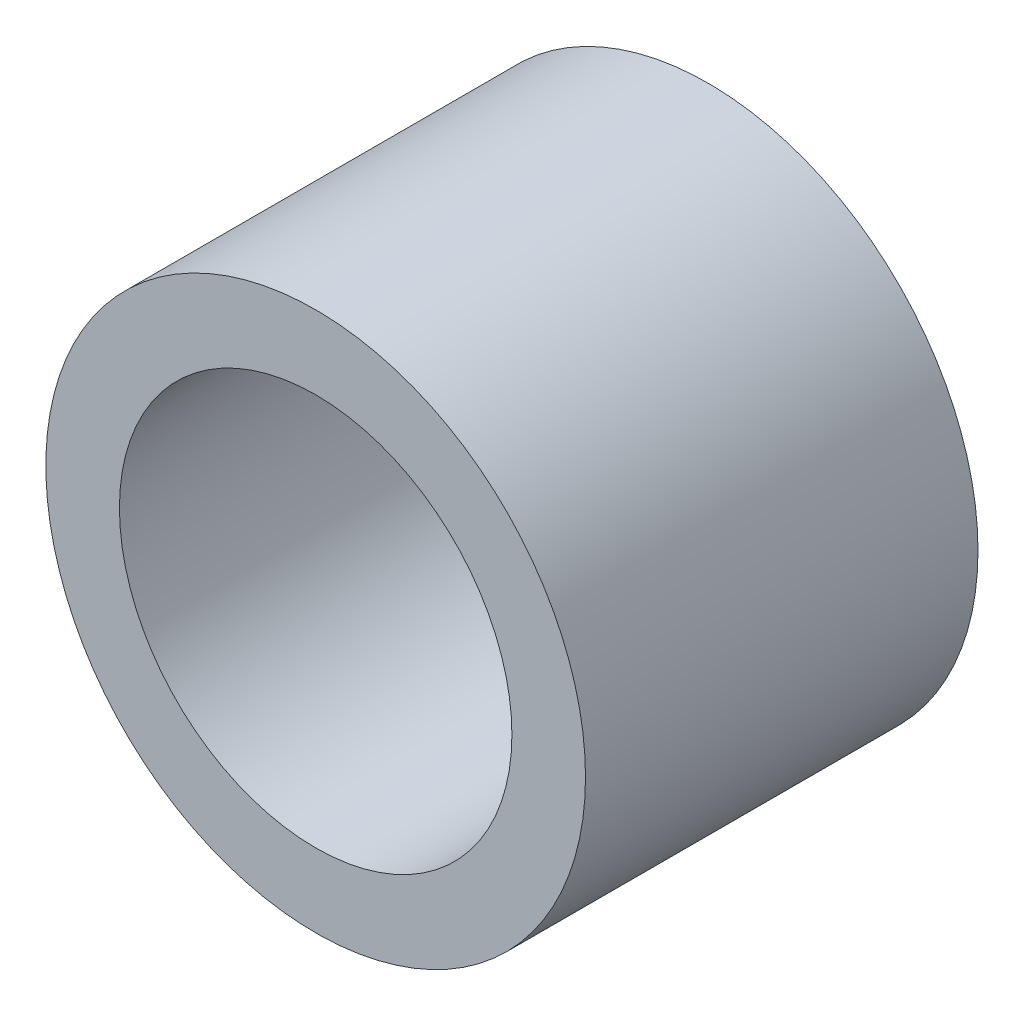
ISO-10303-21;
HEADER;
FILE_DESCRIPTION(('STEP AP214'),'2;1');
FILE_NAME('part.step','',(''),(''),'','','');
FILE_SCHEMA(('AUTOMOTIVE_DESIGN { 1 0 10303 214 1 1 1 1 }'));
ENDSEC;
DATA;
#1=APPLICATION_CONTEXT('core data for automotive mechanical design processes');
#2=APPLICATION_PROTOCOL_DEFINITION('international standard','automotive_design',2000,#1);
#3=PRODUCT_CONTEXT('',#1,'mechanical');
#4=PRODUCT('Part','Part','',(#3));
#5=PRODUCT_RELATED_PRODUCT_CATEGORY('part','',(#4));
#6=PRODUCT_DEFINITION_FORMATION('','',#4);
#7=PRODUCT_DEFINITION_CONTEXT('part definition',#1,'design');
#8=PRODUCT_DEFINITION('design','',#6,#7);
#9=PRODUCT_DEFINITION_SHAPE('','',#8);
#10=(LENGTH_UNIT() NAMED_UNIT(*) SI_UNIT(.MILLI.,.METRE.));
#11=(NAMED_UNIT(*) PLANE_ANGLE_UNIT() SI_UNIT($,.RADIAN.));
#12=(NAMED_UNIT(*) SI_UNIT($,.STERADIAN.) SOLID_ANGLE_UNIT());
#13=UNCERTAINTY_MEASURE_WITH_UNIT(LENGTH_MEASURE(1.E-05),#10,'distance_accuracy_value','');
#14=(GEOMETRIC_REPRESENTATION_CONTEXT(3) GLOBAL_UNCERTAINTY_ASSIGNED_CONTEXT((#13)) GLOBAL_UNIT_ASSIGNED_CONTEXT((#10,
#11,#12)) REPRESENTATION_CONTEXT('',''));
#15=CARTESIAN_POINT('',(0.,0.,0.));
#16=DIRECTION('',(0.,0.,1.));
#17=DIRECTION('',(1.,0.,0.));
#18=AXIS2_PLACEMENT_3D('',#15,#16,#17);
#19=CARTESIAN_POINT('',(0.,0.,8.));
#20=DIRECTION('',(0.,0.,1.));
#21=DIRECTION('',(1.,0.,0.));
#22=AXIS2_PLACEMENT_3D('',#19,#20,#21);
#23=PLANE('',#22);
#24=CARTESIAN_POINT('',(0.,0.,8.));
#25=DIRECTION('',(0.,0.,1.));
#26=DIRECTION('',(1.,0.,0.));
#27=AXIS2_PLACEMENT_3D('',#24,#25,#26);
#28=CIRCLE('',#27,5.5);
#29=CARTESIAN_POINT('',(5.5,0.,8.));
#30=VERTEX_POINT('',#29);
#31=EDGE_CURVE('E10',#30,#30,#28,.T.);
#32=ORIENTED_EDGE('',*,*,#31,.T.);
#33=EDGE_LOOP('',(#32));
#34=FACE_BOUND('',#33,.T.);
#35=CARTESIAN_POINT('',(0.,0.,8.));
#36=DIRECTION('',(0.,0.,1.));
#37=DIRECTION('',(1.,0.,0.));
#38=AXIS2_PLACEMENT_3D('',#35,#36,#37);
#39=CIRCLE('',#38,4.);
#40=CARTESIAN_POINT('',(4.,0.,8.));
#41=VERTEX_POINT('',#40);
#42=EDGE_CURVE('E42',#41,#41,#39,.T.);
#43=ORIENTED_EDGE('',*,*,#42,.F.);
#44=EDGE_LOOP('',(#43));
#45=FACE_BOUND('',#44,.T.);
#46=ADVANCED_FACE('F31',(#34,#45),#23,.T.);
#47=CARTESIAN_POINT('',(0.,0.,0.));
#48=DIRECTION('',(0.,0.,1.));
#49=DIRECTION('',(1.,0.,0.));
#50=AXIS2_PLACEMENT_3D('',#47,#48,#49);
#51=PLANE('',#50);
#52=CARTESIAN_POINT('',(0.,0.,0.));
#53=DIRECTION('',(0.,0.,1.));
#54=DIRECTION('',(1.,0.,0.));
#55=AXIS2_PLACEMENT_3D('',#52,#53,#54);
#56=CIRCLE('',#55,5.5);
#57=CARTESIAN_POINT('',(5.5,0.,0.));
#58=VERTEX_POINT('',#57);
#59=EDGE_CURVE('E35',#58,#58,#56,.T.);
#60=ORIENTED_EDGE('',*,*,#59,.F.);
#61=EDGE_LOOP('',(#60));
#62=FACE_BOUND('',#61,.T.);
#63=CARTESIAN_POINT('',(0.,0.,0.));
#64=DIRECTION('',(0.,0.,1.));
#65=DIRECTION('',(1.,0.,0.));
#66=AXIS2_PLACEMENT_3D('',#63,#64,#65);
#67=CIRCLE('',#66,4.);
#68=CARTESIAN_POINT('',(4.,0.,0.));
#69=VERTEX_POINT('',#68);
#70=EDGE_CURVE('E44',#69,#69,#67,.T.);
#71=ORIENTED_EDGE('',*,*,#70,.T.);
#72=EDGE_LOOP('',(#71));
#73=FACE_BOUND('',#72,.T.);
#74=ADVANCED_FACE('F54',(#62,#73),#51,.F.);
#75=CARTESIAN_POINT('',(0.,0.,8.));
#76=DIRECTION('',(0.,0.,-1.));
#77=DIRECTION('',(-1.,0.,0.));
#78=AXIS2_PLACEMENT_3D('',#75,#76,#77);
#79=CYLINDRICAL_SURFACE('',#78,5.5);
#80=ORIENTED_EDGE('',*,*,#31,.F.);
#81=EDGE_LOOP('',(#80));
#82=FACE_BOUND('',#81,.T.);
#83=ORIENTED_EDGE('',*,*,#59,.T.);
#84=EDGE_LOOP('',(#83));
#85=FACE_BOUND('',#84,.T.);
#86=ADVANCED_FACE('F33',(#82,#85),#79,.T.);
#87=CARTESIAN_POINT('',(0.,0.,8.));
#88=DIRECTION('',(0.,0.,-1.));
#89=DIRECTION('',(-1.,0.,0.));
#90=AXIS2_PLACEMENT_3D('',#87,#88,#89);
#91=CYLINDRICAL_SURFACE('',#90,4.);
#92=ORIENTED_EDGE('',*,*,#42,.T.);
#93=EDGE_LOOP('',(#92));
#94=FACE_BOUND('',#93,.T.);
#95=ORIENTED_EDGE('',*,*,#70,.F.);
#96=EDGE_LOOP('',(#95));
#97=FACE_BOUND('',#96,.T.);
#98=ADVANCED_FACE('F50',(#94,#97),#91,.F.);
#99=CLOSED_SHELL('',(#46,#74,#86,#98));
#100=MANIFOLD_SOLID_BREP('B2',#99);
#101=ADVANCED_BREP_SHAPE_REPRESENTATION('',(#18,#100),#14);
#102=SHAPE_DEFINITION_REPRESENTATION(#9,#101);
ENDSEC;
END-ISO-10303-21;
